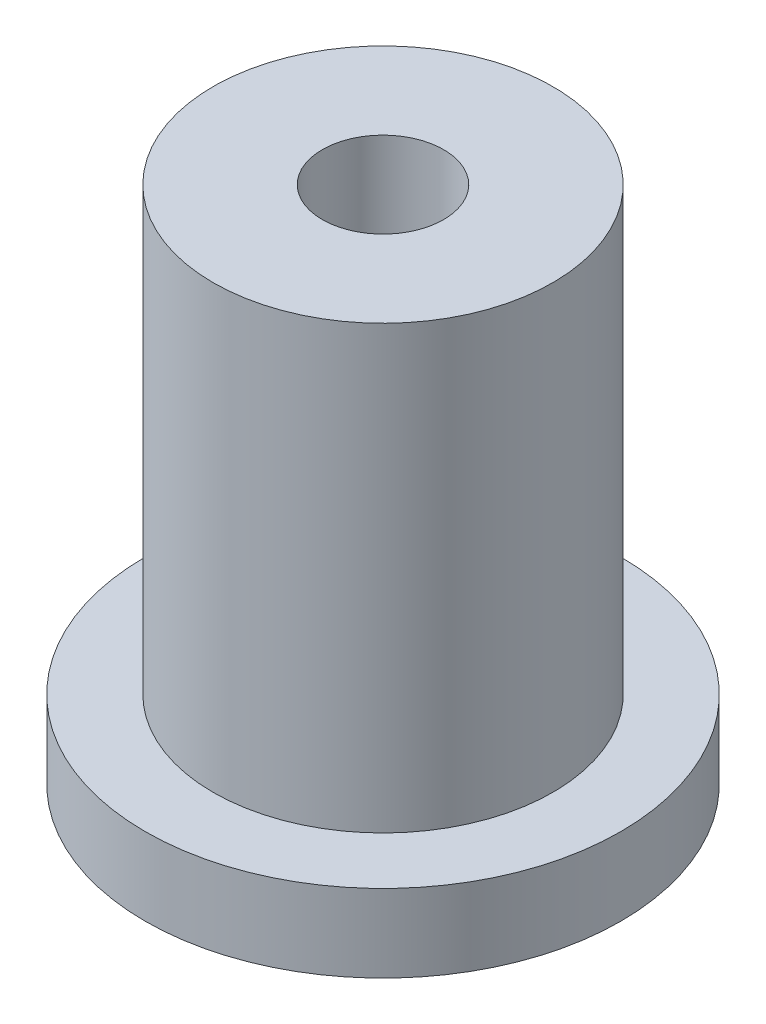
ISO-10303-21;
HEADER;
FILE_DESCRIPTION(('STEP AP214'),'2;1');
FILE_NAME('part.step','',(''),(''),'','','');
FILE_SCHEMA(('AUTOMOTIVE_DESIGN { 1 0 10303 214 1 1 1 1 }'));
ENDSEC;
DATA;
#1=APPLICATION_CONTEXT('core data for automotive mechanical design processes');
#2=APPLICATION_PROTOCOL_DEFINITION('international standard','automotive_design',2000,#1);
#3=PRODUCT_CONTEXT('',#1,'mechanical');
#4=PRODUCT('Part','Part','',(#3));
#5=PRODUCT_RELATED_PRODUCT_CATEGORY('part','',(#4));
#6=PRODUCT_DEFINITION_FORMATION('','',#4);
#7=PRODUCT_DEFINITION_CONTEXT('part definition',#1,'design');
#8=PRODUCT_DEFINITION('design','',#6,#7);
#9=PRODUCT_DEFINITION_SHAPE('','',#8);
#10=(LENGTH_UNIT() NAMED_UNIT(*) SI_UNIT(.MILLI.,.METRE.));
#11=(NAMED_UNIT(*) PLANE_ANGLE_UNIT() SI_UNIT($,.RADIAN.));
#12=(NAMED_UNIT(*) SI_UNIT($,.STERADIAN.) SOLID_ANGLE_UNIT());
#13=UNCERTAINTY_MEASURE_WITH_UNIT(LENGTH_MEASURE(1.E-05),#10,'distance_accuracy_value','');
#14=(GEOMETRIC_REPRESENTATION_CONTEXT(3) GLOBAL_UNCERTAINTY_ASSIGNED_CONTEXT((#13)) GLOBAL_UNIT_ASSIGNED_CONTEXT((#10,
#11,#12)) REPRESENTATION_CONTEXT('',''));
#15=CARTESIAN_POINT('',(0.,0.,0.));
#16=DIRECTION('',(0.,0.,1.));
#17=DIRECTION('',(1.,0.,0.));
#18=AXIS2_PLACEMENT_3D('',#15,#16,#17);
#19=CARTESIAN_POINT('',(-17.5,-43.7927272727273,0.));
#20=DIRECTION('',(0.,1.,0.));
#21=DIRECTION('',(0.,0.,1.));
#22=AXIS2_PLACEMENT_3D('',#19,#20,#21);
#23=PLANE('',#22);
#24=CARTESIAN_POINT('',(0.,-43.7927272727273,0.));
#25=DIRECTION('',(0.,1.,0.));
#26=DIRECTION('',(0.,0.,1.));
#27=AXIS2_PLACEMENT_3D('',#24,#25,#26);
#28=CIRCLE('',#27,6.25);
#29=CARTESIAN_POINT('',(0.,-43.7927272727273,6.25));
#30=VERTEX_POINT('',#29);
#31=EDGE_CURVE('E59',#30,#30,#28,.T.);
#32=ORIENTED_EDGE('',*,*,#31,.F.);
#33=EDGE_LOOP('',(#32));
#34=FACE_BOUND('',#33,.T.);
#35=CARTESIAN_POINT('',(0.,-43.7927272727273,0.));
#36=DIRECTION('',(0.,1.,0.));
#37=DIRECTION('',(0.,0.,1.));
#38=AXIS2_PLACEMENT_3D('',#35,#36,#37);
#39=CIRCLE('',#38,17.5);
#40=CARTESIAN_POINT('',(0.,-43.7927272727273,17.5));
#41=VERTEX_POINT('',#40);
#42=EDGE_CURVE('E63',#41,#41,#39,.T.);
#43=ORIENTED_EDGE('',*,*,#42,.T.);
#44=EDGE_LOOP('',(#43));
#45=FACE_BOUND('',#44,.T.);
#46=ADVANCED_FACE('F39',(#34,#45),#23,.T.);
#47=CARTESIAN_POINT('',(0.,-97.2727272727273,0.));
#48=DIRECTION('',(0.,-1.,0.));
#49=DIRECTION('',(0.,0.,-1.));
#50=AXIS2_PLACEMENT_3D('',#47,#48,#49);
#51=PLANE('',#50);
#52=CARTESIAN_POINT('',(0.,-97.2727272727273,0.));
#53=DIRECTION('',(0.,1.,0.));
#54=DIRECTION('',(0.,0.,1.));
#55=AXIS2_PLACEMENT_3D('',#52,#53,#54);
#56=CIRCLE('',#55,24.5);
#57=CARTESIAN_POINT('',(0.,-97.2727272727273,24.5));
#58=VERTEX_POINT('',#57);
#59=EDGE_CURVE('E11',#58,#58,#56,.T.);
#60=ORIENTED_EDGE('',*,*,#59,.F.);
#61=EDGE_LOOP('',(#60));
#62=FACE_BOUND('',#61,.T.);
#63=ADVANCED_FACE('F81',(#62),#51,.T.);
#64=CARTESIAN_POINT('',(0.,115.909090909091,0.));
#65=DIRECTION('',(0.,1.,0.));
#66=DIRECTION('',(0.,0.,1.));
#67=AXIS2_PLACEMENT_3D('',#64,#65,#66);
#68=CYLINDRICAL_SURFACE('',#67,24.5);
#69=ORIENTED_EDGE('',*,*,#59,.T.);
#70=EDGE_LOOP('',(#69));
#71=FACE_BOUND('',#70,.T.);
#72=CARTESIAN_POINT('',(0.,-89.2727272727273,0.));
#73=DIRECTION('',(0.,1.,0.));
#74=DIRECTION('',(0.,0.,1.));
#75=AXIS2_PLACEMENT_3D('',#72,#73,#74);
#76=CIRCLE('',#75,24.5);
#77=CARTESIAN_POINT('',(0.,-89.2727272727273,24.5));
#78=VERTEX_POINT('',#77);
#79=EDGE_CURVE('E46',#78,#78,#76,.T.);
#80=ORIENTED_EDGE('',*,*,#79,.F.);
#81=EDGE_LOOP('',(#80));
#82=FACE_BOUND('',#81,.T.);
#83=ADVANCED_FACE('F79',(#71,#82),#68,.T.);
#84=CARTESIAN_POINT('',(-24.5,-89.2727272727273,0.));
#85=DIRECTION('',(0.,1.,0.));
#86=DIRECTION('',(0.,0.,1.));
#87=AXIS2_PLACEMENT_3D('',#84,#85,#86);
#88=PLANE('',#87);
#89=ORIENTED_EDGE('',*,*,#79,.T.);
#90=EDGE_LOOP('',(#89));
#91=FACE_BOUND('',#90,.T.);
#92=CARTESIAN_POINT('',(0.,-89.2727272727273,0.));
#93=DIRECTION('',(0.,1.,0.));
#94=DIRECTION('',(0.,0.,1.));
#95=AXIS2_PLACEMENT_3D('',#92,#93,#94);
#96=CIRCLE('',#95,17.5);
#97=CARTESIAN_POINT('',(0.,-89.2727272727273,17.5));
#98=VERTEX_POINT('',#97);
#99=EDGE_CURVE('E69',#98,#98,#96,.T.);
#100=ORIENTED_EDGE('',*,*,#99,.F.);
#101=EDGE_LOOP('',(#100));
#102=FACE_BOUND('',#101,.T.);
#103=ADVANCED_FACE('F76',(#91,#102),#88,.T.);
#104=CARTESIAN_POINT('',(0.,115.909090909091,0.));
#105=DIRECTION('',(0.,1.,0.));
#106=DIRECTION('',(0.,0.,1.));
#107=AXIS2_PLACEMENT_3D('',#104,#105,#106);
#108=CYLINDRICAL_SURFACE('',#107,17.5);
#109=ORIENTED_EDGE('',*,*,#99,.T.);
#110=EDGE_LOOP('',(#109));
#111=FACE_BOUND('',#110,.T.);
#112=ORIENTED_EDGE('',*,*,#42,.F.);
#113=EDGE_LOOP('',(#112));
#114=FACE_BOUND('',#113,.T.);
#115=ADVANCED_FACE('F88',(#111,#114),#108,.T.);
#116=CARTESIAN_POINT('',(0.,-43.7927272727273,0.));
#117=DIRECTION('',(0.,1.,0.));
#118=DIRECTION('',(0.,0.,1.));
#119=AXIS2_PLACEMENT_3D('',#116,#117,#118);
#120=CYLINDRICAL_SURFACE('',#119,6.25);
#121=CARTESIAN_POINT('',(0.,-73.7927272727273,0.));
#122=DIRECTION('',(0.,1.,0.));
#123=DIRECTION('',(0.,0.,1.));
#124=AXIS2_PLACEMENT_3D('',#121,#122,#123);
#125=CIRCLE('',#124,6.25);
#126=CARTESIAN_POINT('',(0.,-73.7927272727273,6.25));
#127=VERTEX_POINT('',#126);
#128=EDGE_CURVE('E56',#127,#127,#125,.T.);
#129=ORIENTED_EDGE('',*,*,#128,.F.);
#130=EDGE_LOOP('',(#129));
#131=FACE_BOUND('',#130,.T.);
#132=ORIENTED_EDGE('',*,*,#31,.T.);
#133=EDGE_LOOP('',(#132));
#134=FACE_BOUND('',#133,.T.);
#135=ADVANCED_FACE('F52',(#131,#134),#120,.F.);
#136=CARTESIAN_POINT('',(0.,-73.7927272727273,0.));
#137=DIRECTION('',(0.,1.,0.));
#138=DIRECTION('',(0.,0.,1.));
#139=AXIS2_PLACEMENT_3D('',#136,#137,#138);
#140=CONICAL_SURFACE('',#139,6.25,1.02974425867666);
#141=CARTESIAN_POINT('',(0.,-77.5481061416495,0.));
#142=VERTEX_POINT('',#141);
#143=VERTEX_LOOP('',#142);
#144=FACE_BOUND('',#143,.T.);
#145=ORIENTED_EDGE('',*,*,#128,.T.);
#146=EDGE_LOOP('',(#145));
#147=FACE_BOUND('',#146,.T.);
#148=ADVANCED_FACE('F49',(#144,#147),#140,.F.);
#149=CLOSED_SHELL('',(#46,#63,#83,#103,#115,#135,#148));
#150=MANIFOLD_SOLID_BREP('B2',#149);
#151=ADVANCED_BREP_SHAPE_REPRESENTATION('',(#18,#150),#14);
#152=SHAPE_DEFINITION_REPRESENTATION(#9,#151);
ENDSEC;
END-ISO-10303-21;
